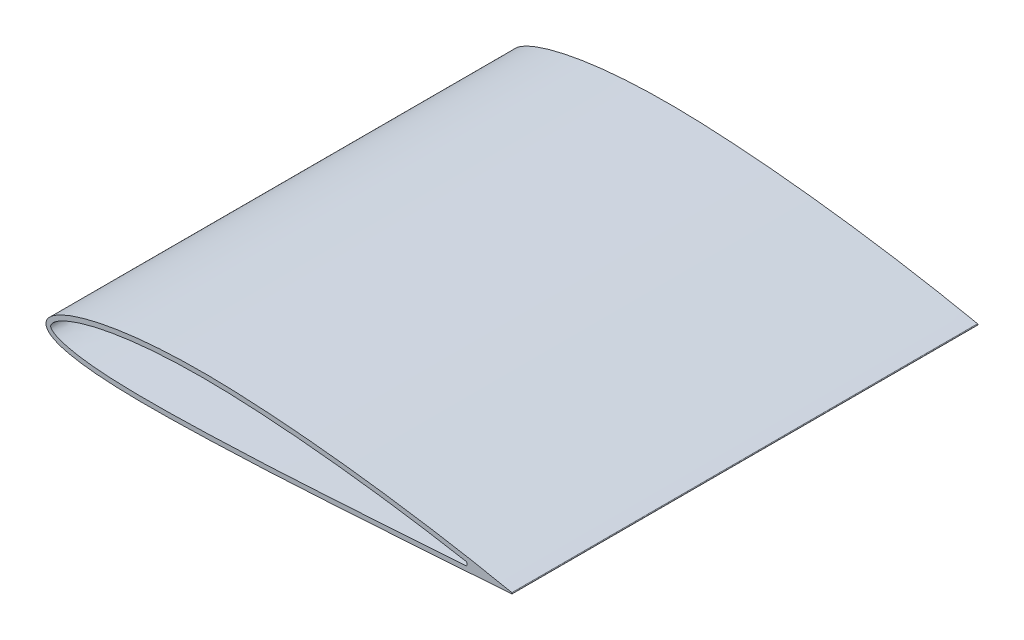
ISO-10303-21;
HEADER;
FILE_DESCRIPTION(('STEP AP214'),'2;1');
FILE_NAME('part.step','',(''),(''),'','','');
FILE_SCHEMA(('AUTOMOTIVE_DESIGN { 1 0 10303 214 1 1 1 1 }'));
ENDSEC;
DATA;
#1=APPLICATION_CONTEXT('core data for automotive mechanical design processes');
#2=APPLICATION_PROTOCOL_DEFINITION('international standard','automotive_design',2000,#1);
#3=PRODUCT_CONTEXT('',#1,'mechanical');
#4=PRODUCT('Part','Part','',(#3));
#5=PRODUCT_RELATED_PRODUCT_CATEGORY('part','',(#4));
#6=PRODUCT_DEFINITION_FORMATION('','',#4);
#7=PRODUCT_DEFINITION_CONTEXT('part definition',#1,'design');
#8=PRODUCT_DEFINITION('design','',#6,#7);
#9=PRODUCT_DEFINITION_SHAPE('','',#8);
#10=(LENGTH_UNIT() NAMED_UNIT(*) SI_UNIT(.MILLI.,.METRE.));
#11=(NAMED_UNIT(*) PLANE_ANGLE_UNIT() SI_UNIT($,.RADIAN.));
#12=(NAMED_UNIT(*) SI_UNIT($,.STERADIAN.) SOLID_ANGLE_UNIT());
#13=UNCERTAINTY_MEASURE_WITH_UNIT(LENGTH_MEASURE(1.E-05),#10,'distance_accuracy_value','');
#14=(GEOMETRIC_REPRESENTATION_CONTEXT(3) GLOBAL_UNCERTAINTY_ASSIGNED_CONTEXT((#13)) GLOBAL_UNIT_ASSIGNED_CONTEXT((#10,
#11,#12)) REPRESENTATION_CONTEXT('',''));
#15=CARTESIAN_POINT('',(0.,0.,0.));
#16=DIRECTION('',(0.,0.,1.));
#17=DIRECTION('',(1.,0.,0.));
#18=AXIS2_PLACEMENT_3D('',#15,#16,#17);
#19=CARTESIAN_POINT('',(100.0084,0.1257,-50.));
#20=CARTESIAN_POINT('',(99.9575006417878,0.136303081755937,-50.));
#21=CARTESIAN_POINT('',(99.7541920163566,0.178655245964887,-50.));
#22=CARTESIAN_POINT('',(99.2978769571782,0.273366978741733,-50.));
#23=CARTESIAN_POINT('',(98.5402830188608,0.429255228373811,-50.));
#24=CARTESIAN_POINT('',(97.4857254404918,0.643248231747518,-50.));
#25=CARTESIAN_POINT('',(96.1404333434782,0.911804494217144,-50.));
#26=CARTESIAN_POINT('',(94.5121744087844,1.22992061088621,-50.));
#27=CARTESIAN_POINT('',(92.610509120304,1.5921083415293,-50.));
#28=CARTESIAN_POINT('',(90.4466340394745,1.99248175179455,-50.));
#29=CARTESIAN_POINT('',(88.0332876433102,2.42422523893592,-50.));
#30=CARTESIAN_POINT('',(85.3848895453396,2.88061502468652,-50.));
#31=CARTESIAN_POINT('',(82.5172188837452,3.35474330699771,-50.));
#32=CARTESIAN_POINT('',(79.4474797418673,3.83931371203246,-50.));
#33=CARTESIAN_POINT('',(76.1941779254634,4.32719677177443,-50.));
#34=CARTESIAN_POINT('',(71.5503435843931,4.98521306770589,-50.));
#35=CARTESIAN_POINT('',(66.7275942207592,5.60405914980638,-50.));
#36=CARTESIAN_POINT('',(61.7557579202433,6.17071888034306,-50.));
#37=CARTESIAN_POINT('',(57.9004617902013,6.56952763892746,-50.));
#38=CARTESIAN_POINT('',(53.9937317033733,6.93053270192435,-50.));
#39=CARTESIAN_POINT('',(50.0598360752011,7.24644777972921,-50.));
#40=CARTESIAN_POINT('',(46.1233934133396,7.51210941454698,-50.));
#41=CARTESIAN_POINT('',(42.2045942977767,7.72123436281601,-50.));
#42=CARTESIAN_POINT('',(38.3222400692063,7.87110588804238,-50.));
#43=CARTESIAN_POINT('',(34.5002474040471,7.93415918044593,-50.));
#44=CARTESIAN_POINT('',(30.7683195438099,7.90989675298229,-50.));
#45=CARTESIAN_POINT('',(27.1568114856263,7.79775933433704,-50.));
#46=CARTESIAN_POINT('',(23.6895963362792,7.59910508048005,-50.));
#47=CARTESIAN_POINT('',(20.389609151732,7.31688787947149,-50.));
#48=CARTESIAN_POINT('',(17.2785007010388,6.95607203421987,-50.));
#49=CARTESIAN_POINT('',(14.3766029315202,6.52271381253916,-50.));
#50=CARTESIAN_POINT('',(11.7025215340396,6.02448117746504,-50.));
#51=CARTESIAN_POINT('',(9.27317556964736,5.46982243442795,-50.));
#52=CARTESIAN_POINT('',(7.10323060909228,4.86867952905806,-50.));
#53=CARTESIAN_POINT('',(5.20552883721737,4.23033653202801,-50.));
#54=CARTESIAN_POINT('',(3.59010281607919,3.5649334936196,-50.));
#55=CARTESIAN_POINT('',(2.26448505082284,2.881327397096,-50.));
#56=CARTESIAN_POINT('',(1.23198078336141,2.1863038341037,-50.));
#57=CARTESIAN_POINT('',(0.493177741150568,1.48131319264006,-50.));
#58=CARTESIAN_POINT('',(0.0485522705245891,0.752337561566812,-50.));
#59=CARTESIAN_POINT('',(-0.0570136593623045,-0.00571041771230951,-50.));
#60=CARTESIAN_POINT('',(0.196243247423825,-0.727199534008104,-50.));
#61=CARTESIAN_POINT('',(0.771771309563745,-1.35444891061111,-50.));
#62=CARTESIAN_POINT('',(1.62569911056504,-1.90367474790789,-50.));
#63=CARTESIAN_POINT('',(2.75774768096447,-2.39272267984389,-50.));
#64=CARTESIAN_POINT('',(4.16602288448137,-2.82408903967875,-50.));
#65=CARTESIAN_POINT('',(5.84462873775599,-3.1982600621209,-50.));
#66=CARTESIAN_POINT('',(7.78438739116766,-3.51428428992608,-50.));
#67=CARTESIAN_POINT('',(9.97388385069773,-3.77187784890552,-50.));
#68=CARTESIAN_POINT('',(12.3999839443877,-3.9714543991754,-50.));
#69=CARTESIAN_POINT('',(15.0482180581845,-4.11469854326143,-50.));
#70=CARTESIAN_POINT('',(17.9029955448966,-4.20389475218304,-50.));
#71=CARTESIAN_POINT('',(20.9476756212284,-4.24275896536731,-50.));
#72=CARTESIAN_POINT('',(24.1647279910577,-4.23550981543448,-50.));
#73=CARTESIAN_POINT('',(27.5357350343822,-4.18789909066796,-50.));
#74=CARTESIAN_POINT('',(31.0414974365474,-4.10572724311399,-50.));
#75=CARTESIAN_POINT('',(34.6620643552298,-3.99612622553502,-50.));
#76=CARTESIAN_POINT('',(38.3825266791671,-3.86487109700884,-50.));
#77=CARTESIAN_POINT('',(42.1859458780592,-3.72112454728212,-50.));
#78=CARTESIAN_POINT('',(46.0489227532139,-3.54729203687554,-50.));
#79=CARTESIAN_POINT('',(49.9424393487425,-3.35207456203044,-50.));
#80=CARTESIAN_POINT('',(53.8384179526144,-3.13972644784349,-50.));
#81=CARTESIAN_POINT('',(57.7132169269346,-2.91628127020657,-50.));
#82=CARTESIAN_POINT('',(61.5431764467593,-2.68580173348918,-50.));
#83=CARTESIAN_POINT('',(65.3047975262927,-2.452787617943,-50.));
#84=CARTESIAN_POINT('',(68.9748831765251,-2.22022419869638,-50.));
#85=CARTESIAN_POINT('',(72.5307541322065,-1.99138463464445,-50.));
#86=CARTESIAN_POINT('',(75.9503066540022,-1.76872011408288,-50.));
#87=CARTESIAN_POINT('',(79.2121937829807,-1.55411509645417,-50.));
#88=CARTESIAN_POINT('',(82.2959317242,-1.34954223240076,-50.));
#89=CARTESIAN_POINT('',(85.1821198000955,-1.15608962280362,-50.));
#90=CARTESIAN_POINT('',(87.8524937198297,-0.975689090094754,-50.));
#91=CARTESIAN_POINT('',(90.2900863575627,-0.809239476368863,-50.));
#92=CARTESIAN_POINT('',(92.4793196593868,-0.658331335669369,-50.));
#93=CARTESIAN_POINT('',(94.4061789761468,-0.5240513364417,-50.));
#94=CARTESIAN_POINT('',(96.0582651199385,-0.40768295662181,-50.));
#95=CARTESIAN_POINT('',(97.4248948760103,-0.310661925785944,-50.));
#96=CARTESIAN_POINT('',(98.4971789015927,-0.233770416248037,-50.));
#97=CARTESIAN_POINT('',(99.2681465010762,-0.178282012173191,-50.));
#98=CARTESIAN_POINT('',(99.7327341306056,-0.144510966638083,-50.));
#99=CARTESIAN_POINT('',(99.9397666594647,-0.129466565448862,-50.));
#100=CARTESIAN_POINT('',(99.9916,-0.1257,-50.));
#101=B_SPLINE_CURVE_WITH_KNOTS('',3,(#19,#20,#21,#22,#23,#24,#25,#26,#27,#28,#29,#30,#31,#32,
#33,#34,#35,#36,#37,#38,#39,#40,#41,#42,#43,#44,#45,#46,#47,#48,#49,#50,#51,#52,#53,#54,#55,#56,
#57,#58,#59,#60,#61,#62,#63,#64,#65,#66,#67,#68,#69,#70,#71,#72,#73,#74,#75,#76,#77,#78,#79,#80,
#81,#82,#83,#84,#85,#86,#87,#88,#89,#90,#91,#92,#93,#94,#95,#96,#97,#98,#99,#100),.UNSPECIFIED.,
.F.,.F.,(4,1,1,1,1,1,1,1,1,1,1,1,1,1,1,1,1,1,1,1,1,1,1,1,1,1,1,1,1,1,1,1,1,1,1,1,1,1,1,1,1,1,1,
1,1,1,1,1,1,1,1,1,1,1,1,1,1,1,1,1,1,1,1,1,1,1,1,1,1,1,1,1,1,1,1,1,1,1,1,4),(0.,
0.00076417244153373,0.00305235378475402,0.00684980570482115,0.0121324733985665,
0.0188679915200487,0.0270128393038132,0.0365168120832152,0.047320748010187,0.0593568710051226,
0.0725508051219635,0.0868200523054509,0.102077397543794,0.118227703036746,0.135170889253622,
0.171012918486622,0.189689890020379,0.2087182097852,0.227978894661608,0.247353901281394,
0.266722824804597,0.285966042812018,0.305032180166146,0.323824436620937,0.342143816816601,
0.359879710568799,0.37692581771828,0.393181852747689,0.408552719103574,0.422951452754658,
0.436298148768817,0.448522824449468,0.459565427988144,0.469379445279197,0.477933615883346,
0.48522033832909,0.491267538221565,0.49616782391953,0.500133390493784,0.503587222302178,
0.507040596825175,0.511000027817938,0.515876124661788,0.521872238721079,0.529071214980825,
0.537494990853373,0.547131181284723,0.557945450904502,0.569889642117144,0.582904388224719,
0.59692167175937,0.611866369391749,0.627656322240658,0.644204240139434,0.661417059233681,
0.679197208253312,0.697442956346586,0.716133922541477,0.735139063012098,0.754277540168221,
0.773432072201266,0.792486536790152,0.811323415788078,0.829826150136362,0.847880343752471,
0.865374072591972,0.882198024915322,0.898246949642392,0.91342054427208,0.927622056045171,
0.940762976250731,0.952758837637558,0.963532927047773,0.973016417754069,0.981148267698661,
0.987875251513711,0.993153530447754,0.996949037264165,0.999236150998499,1.),.UNSPECIFIED.);
#102=DIRECTION('',(0.,0.,1.));
#103=VECTOR('',#102,1.);
#104=SURFACE_OF_LINEAR_EXTRUSION('',#101,#103);
#105=DIRECTION('',(0.,0.,1.));
#106=VECTOR('',#105,1.);
#107=CARTESIAN_POINT('',(99.9916,-0.1257,-50.));
#108=LINE('',#107,#106);
#109=CARTESIAN_POINT('',(99.9916,-0.1257,-50.));
#110=VERTEX_POINT('',#109);
#111=CARTESIAN_POINT('',(99.9916,-0.1257,50.));
#112=VERTEX_POINT('',#111);
#113=EDGE_CURVE('E39',#110,#112,#108,.T.);
#114=ORIENTED_EDGE('',*,*,#113,.T.);
#115=CARTESIAN_POINT('',(100.0084,0.1257,50.));
#116=CARTESIAN_POINT('',(99.9575006417878,0.136303081755937,50.));
#117=CARTESIAN_POINT('',(99.7541920163566,0.178655245964887,50.));
#118=CARTESIAN_POINT('',(99.2978769571782,0.273366978741733,50.));
#119=CARTESIAN_POINT('',(98.5402830188608,0.429255228373811,50.));
#120=CARTESIAN_POINT('',(97.4857254404918,0.643248231747518,50.));
#121=CARTESIAN_POINT('',(96.1404333434782,0.911804494217144,50.));
#122=CARTESIAN_POINT('',(94.5121744087844,1.22992061088621,50.));
#123=CARTESIAN_POINT('',(92.610509120304,1.5921083415293,50.));
#124=CARTESIAN_POINT('',(90.4466340394745,1.99248175179455,50.));
#125=CARTESIAN_POINT('',(88.0332876433102,2.42422523893592,50.));
#126=CARTESIAN_POINT('',(85.3848895453396,2.88061502468652,50.));
#127=CARTESIAN_POINT('',(82.5172188837452,3.35474330699771,50.));
#128=CARTESIAN_POINT('',(79.4474797418673,3.83931371203246,50.));
#129=CARTESIAN_POINT('',(76.1941779254634,4.32719677177443,50.));
#130=CARTESIAN_POINT('',(71.5503435843931,4.98521306770589,50.));
#131=CARTESIAN_POINT('',(66.7275942207592,5.60405914980638,50.));
#132=CARTESIAN_POINT('',(61.7557579202433,6.17071888034306,50.));
#133=CARTESIAN_POINT('',(57.9004617902013,6.56952763892746,50.));
#134=CARTESIAN_POINT('',(53.9937317033733,6.93053270192435,50.));
#135=CARTESIAN_POINT('',(50.0598360752011,7.24644777972921,50.));
#136=CARTESIAN_POINT('',(46.1233934133396,7.51210941454698,50.));
#137=CARTESIAN_POINT('',(42.2045942977767,7.72123436281601,50.));
#138=CARTESIAN_POINT('',(38.3222400692063,7.87110588804238,50.));
#139=CARTESIAN_POINT('',(34.5002474040471,7.93415918044593,50.));
#140=CARTESIAN_POINT('',(30.7683195438099,7.90989675298229,50.));
#141=CARTESIAN_POINT('',(27.1568114856263,7.79775933433704,50.));
#142=CARTESIAN_POINT('',(23.6895963362792,7.59910508048005,50.));
#143=CARTESIAN_POINT('',(20.389609151732,7.31688787947149,50.));
#144=CARTESIAN_POINT('',(17.2785007010388,6.95607203421987,50.));
#145=CARTESIAN_POINT('',(14.3766029315202,6.52271381253916,50.));
#146=CARTESIAN_POINT('',(11.7025215340396,6.02448117746504,50.));
#147=CARTESIAN_POINT('',(9.27317556964736,5.46982243442795,50.));
#148=CARTESIAN_POINT('',(7.10323060909228,4.86867952905806,50.));
#149=CARTESIAN_POINT('',(5.20552883721737,4.23033653202801,50.));
#150=CARTESIAN_POINT('',(3.59010281607919,3.5649334936196,50.));
#151=CARTESIAN_POINT('',(2.26448505082284,2.881327397096,50.));
#152=CARTESIAN_POINT('',(1.23198078336141,2.1863038341037,50.));
#153=CARTESIAN_POINT('',(0.493177741150568,1.48131319264006,50.));
#154=CARTESIAN_POINT('',(0.0485522705245891,0.752337561566812,50.));
#155=CARTESIAN_POINT('',(-0.0570136593623045,-0.00571041771230951,50.));
#156=CARTESIAN_POINT('',(0.196243247423825,-0.727199534008104,50.));
#157=CARTESIAN_POINT('',(0.771771309563745,-1.35444891061111,50.));
#158=CARTESIAN_POINT('',(1.62569911056504,-1.90367474790789,50.));
#159=CARTESIAN_POINT('',(2.75774768096447,-2.39272267984389,50.));
#160=CARTESIAN_POINT('',(4.16602288448137,-2.82408903967875,50.));
#161=CARTESIAN_POINT('',(5.84462873775599,-3.1982600621209,50.));
#162=CARTESIAN_POINT('',(7.78438739116766,-3.51428428992608,50.));
#163=CARTESIAN_POINT('',(9.97388385069773,-3.77187784890552,50.));
#164=CARTESIAN_POINT('',(12.3999839443877,-3.9714543991754,50.));
#165=CARTESIAN_POINT('',(15.0482180581845,-4.11469854326143,50.));
#166=CARTESIAN_POINT('',(17.9029955448966,-4.20389475218304,50.));
#167=CARTESIAN_POINT('',(20.9476756212284,-4.24275896536731,50.));
#168=CARTESIAN_POINT('',(24.1647279910577,-4.23550981543448,50.));
#169=CARTESIAN_POINT('',(27.5357350343822,-4.18789909066796,50.));
#170=CARTESIAN_POINT('',(31.0414974365474,-4.10572724311399,50.));
#171=CARTESIAN_POINT('',(34.6620643552298,-3.99612622553502,50.));
#172=CARTESIAN_POINT('',(38.3825266791671,-3.86487109700884,50.));
#173=CARTESIAN_POINT('',(42.1859458780592,-3.72112454728212,50.));
#174=CARTESIAN_POINT('',(46.0489227532139,-3.54729203687554,50.));
#175=CARTESIAN_POINT('',(49.9424393487425,-3.35207456203044,50.));
#176=CARTESIAN_POINT('',(53.8384179526144,-3.13972644784349,50.));
#177=CARTESIAN_POINT('',(57.7132169269346,-2.91628127020657,50.));
#178=CARTESIAN_POINT('',(61.5431764467593,-2.68580173348918,50.));
#179=CARTESIAN_POINT('',(65.3047975262927,-2.452787617943,50.));
#180=CARTESIAN_POINT('',(68.9748831765251,-2.22022419869638,50.));
#181=CARTESIAN_POINT('',(72.5307541322065,-1.99138463464445,50.));
#182=CARTESIAN_POINT('',(75.9503066540022,-1.76872011408288,50.));
#183=CARTESIAN_POINT('',(79.2121937829807,-1.55411509645417,50.));
#184=CARTESIAN_POINT('',(82.2959317242,-1.34954223240076,50.));
#185=CARTESIAN_POINT('',(85.1821198000955,-1.15608962280362,50.));
#186=CARTESIAN_POINT('',(87.8524937198297,-0.975689090094754,50.));
#187=CARTESIAN_POINT('',(90.2900863575627,-0.809239476368863,50.));
#188=CARTESIAN_POINT('',(92.4793196593868,-0.658331335669369,50.));
#189=CARTESIAN_POINT('',(94.4061789761468,-0.5240513364417,50.));
#190=CARTESIAN_POINT('',(96.0582651199385,-0.40768295662181,50.));
#191=CARTESIAN_POINT('',(97.4248948760103,-0.310661925785944,50.));
#192=CARTESIAN_POINT('',(98.4971789015927,-0.233770416248037,50.));
#193=CARTESIAN_POINT('',(99.2681465010762,-0.178282012173191,50.));
#194=CARTESIAN_POINT('',(99.7327341306056,-0.144510966638083,50.));
#195=CARTESIAN_POINT('',(99.9397666594647,-0.129466565448862,50.));
#196=CARTESIAN_POINT('',(99.9916,-0.1257,50.));
#197=B_SPLINE_CURVE_WITH_KNOTS('',3,(#115,#116,#117,#118,#119,#120,#121,#122,#123,#124,#125,
#126,#127,#128,#129,#130,#131,#132,#133,#134,#135,#136,#137,#138,#139,#140,#141,#142,#143,#144,
#145,#146,#147,#148,#149,#150,#151,#152,#153,#154,#155,#156,#157,#158,#159,#160,#161,#162,#163,
#164,#165,#166,#167,#168,#169,#170,#171,#172,#173,#174,#175,#176,#177,#178,#179,#180,#181,#182,
#183,#184,#185,#186,#187,#188,#189,#190,#191,#192,#193,#194,#195,#196),.UNSPECIFIED.,.F.,.F.,(4,
1,1,1,1,1,1,1,1,1,1,1,1,1,1,1,1,1,1,1,1,1,1,1,1,1,1,1,1,1,1,1,1,1,1,1,1,1,1,1,1,1,1,1,1,1,1,1,1,
1,1,1,1,1,1,1,1,1,1,1,1,1,1,1,1,1,1,1,1,1,1,1,1,1,1,1,1,1,1,4),(0.,0.00076417244153373,
0.00305235378475402,0.00684980570482115,0.0121324733985665,0.0188679915200487,
0.0270128393038132,0.0365168120832152,0.047320748010187,0.0593568710051226,0.0725508051219635,
0.0868200523054509,0.102077397543794,0.118227703036746,0.135170889253622,0.171012918486622,
0.189689890020379,0.2087182097852,0.227978894661608,0.247353901281394,0.266722824804597,
0.285966042812018,0.305032180166146,0.323824436620937,0.342143816816601,0.359879710568799,
0.37692581771828,0.393181852747689,0.408552719103574,0.422951452754658,0.436298148768817,
0.448522824449468,0.459565427988144,0.469379445279197,0.477933615883346,0.48522033832909,
0.491267538221565,0.49616782391953,0.500133390493784,0.503587222302178,0.507040596825175,
0.511000027817938,0.515876124661788,0.521872238721079,0.529071214980825,0.537494990853373,
0.547131181284723,0.557945450904502,0.569889642117144,0.582904388224719,0.59692167175937,
0.611866369391749,0.627656322240658,0.644204240139434,0.661417059233681,0.679197208253312,
0.697442956346586,0.716133922541477,0.735139063012098,0.754277540168221,0.773432072201266,
0.792486536790152,0.811323415788078,0.829826150136362,0.847880343752471,0.865374072591972,
0.882198024915322,0.898246949642392,0.91342054427208,0.927622056045171,0.940762976250731,
0.952758837637558,0.963532927047773,0.973016417754069,0.981148267698661,0.987875251513711,
0.993153530447754,0.996949037264165,0.999236150998499,1.),.UNSPECIFIED.);
#198=CARTESIAN_POINT('',(100.0084,0.1257,50.));
#199=VERTEX_POINT('',#198);
#200=EDGE_CURVE('E122',#199,#112,#197,.T.);
#201=ORIENTED_EDGE('',*,*,#200,.F.);
#202=DIRECTION('',(0.,0.,1.));
#203=VECTOR('',#202,1.);
#204=CARTESIAN_POINT('',(100.0084,0.1257,-50.));
#205=LINE('',#204,#203);
#206=CARTESIAN_POINT('',(100.0084,0.1257,-50.));
#207=VERTEX_POINT('',#206);
#208=EDGE_CURVE('E11',#207,#199,#205,.T.);
#209=ORIENTED_EDGE('',*,*,#208,.F.);
#210=EDGE_CURVE('E123',#207,#110,#101,.T.);
#211=ORIENTED_EDGE('',*,*,#210,.T.);
#212=EDGE_LOOP('',(#114,#201,#209,#211));
#213=FACE_BOUND('',#212,.T.);
#214=ADVANCED_FACE('F35',(#213),#104,.T.);
#215=CARTESIAN_POINT('',(99.9823802152775,0.00117745578097881,-50.));
#216=DIRECTION('',(0.,0.,1.));
#217=DIRECTION('',(1.,0.,0.));
#218=AXIS2_PLACEMENT_3D('',#215,#216,#217);
#219=CYLINDRICAL_SURFACE('',#218,0.127212001068232);
#220=ORIENTED_EDGE('',*,*,#208,.T.);
#221=CARTESIAN_POINT('',(99.9823802152775,0.00117745578097881,50.));
#222=DIRECTION('',(0.,0.,1.));
#223=DIRECTION('',(-1.,0.,0.));
#224=AXIS2_PLACEMENT_3D('',#221,#222,#223);
#225=CIRCLE('',#224,0.127212001068232);
#226=EDGE_CURVE('E115',#112,#199,#225,.T.);
#227=ORIENTED_EDGE('',*,*,#226,.F.);
#228=ORIENTED_EDGE('',*,*,#113,.F.);
#229=CARTESIAN_POINT('',(99.9823802152775,0.00117745578097881,-50.));
#230=DIRECTION('',(0.,0.,1.));
#231=DIRECTION('',(-1.,0.,0.));
#232=AXIS2_PLACEMENT_3D('',#229,#230,#231);
#233=CIRCLE('',#232,0.127212001068232);
#234=EDGE_CURVE('E118',#110,#207,#233,.T.);
#235=ORIENTED_EDGE('',*,*,#234,.T.);
#236=EDGE_LOOP('',(#220,#227,#228,#235));
#237=FACE_BOUND('',#236,.T.);
#238=ADVANCED_FACE('F104',(#237),#219,.T.);
#239=CARTESIAN_POINT('',(0.0949884047592712,0.725559070667126,-50.));
#240=DIRECTION('',(0.,0.,-1.));
#241=DIRECTION('',(-1.,0.,0.));
#242=AXIS2_PLACEMENT_3D('',#239,#240,#241);
#243=PLANE('',#242);
#244=CARTESIAN_POINT('',(90.2254297675662,0.188925752533863,-50.));
#245=CARTESIAN_POINT('',(86.3917270205178,-0.0740794826254042,-50.));
#246=CARTESIAN_POINT('',(78.7236075324969,-0.587537275044594,-50.));
#247=CARTESIAN_POINT('',(67.2191298203727,-1.33609364100195,-50.));
#248=CARTESIAN_POINT('',(55.7152353574862,-2.04382022666368,-50.));
#249=CARTESIAN_POINT('',(46.1301287789258,-2.56128382805623,-50.));
#250=CARTESIAN_POINT('',(38.4616528141261,-2.864682945757,-50.));
#251=CARTESIAN_POINT('',(32.7041610475792,-3.06273125170188,-50.));
#252=CARTESIAN_POINT('',(26.9532983979744,-3.20827101515927,-50.));
#253=CARTESIAN_POINT('',(21.2079812777182,-3.26144589830252,-50.));
#254=CARTESIAN_POINT('',(15.4765693689314,-3.16252888833659,-50.));
#255=CARTESIAN_POINT('',(10.7257526542787,-2.87294905568461,-50.));
#256=CARTESIAN_POINT('',(7.449835773396,-2.45962957972359,-50.));
#257=CARTESIAN_POINT('',(5.61314130623256,-2.12595351430933,-50.));
#258=CARTESIAN_POINT('',(4.26522875064275,-1.81154161365711,-50.));
#259=CARTESIAN_POINT('',(2.97610461269597,-1.40759359078016,-50.));
#260=CARTESIAN_POINT('',(1.79512466062634,-0.880663228352444,-50.));
#261=CARTESIAN_POINT('',(1.10758556100872,-0.288136624993371,-50.));
#262=CARTESIAN_POINT('',(0.979957435234556,0.0776201459086632,-50.));
#263=CARTESIAN_POINT('',(0.998172673536416,0.419051750067922,-50.));
#264=CARTESIAN_POINT('',(1.48450944880804,1.1212495905123,-50.));
#265=CARTESIAN_POINT('',(2.52385370753079,1.87082828027452,-50.));
#266=CARTESIAN_POINT('',(3.70219288747207,2.5073584412873,-50.));
#267=CARTESIAN_POINT('',(5.38454910491288,3.23975763807053,-50.));
#268=CARTESIAN_POINT('',(7.59682353002519,3.98712410494964,-50.));
#269=CARTESIAN_POINT('',(10.3302739105193,4.70412481015007,-50.));
#270=CARTESIAN_POINT('',(13.1093684331999,5.28433508904608,-50.));
#271=CARTESIAN_POINT('',(16.8534027227903,5.90984872392655,-50.));
#272=CARTESIAN_POINT('',(21.5809448429757,6.45859644337838,-50.));
#273=CARTESIAN_POINT('',(27.2897634233443,6.82739350341328,-50.));
#274=CARTESIAN_POINT('',(33.0167408040904,6.95525043498073,-50.));
#275=CARTESIAN_POINT('',(38.7463220589115,6.87375014704901,-50.));
#276=CARTESIAN_POINT('',(46.3961037062899,6.52855551880696,-50.));
#277=CARTESIAN_POINT('',(55.9489473748948,5.80867608395894,-50.));
#278=CARTESIAN_POINT('',(67.382503041369,4.55778180896341,-50.));
#279=CARTESIAN_POINT('',(78.7779704527553,2.97941278864366,-50.));
#280=CARTESIAN_POINT('',(86.342842876454,1.71866587687634,-50.));
#281=CARTESIAN_POINT('',(90.1152906933034,1.03396947972568,-50.));
#282=B_SPLINE_CURVE_WITH_KNOTS('',3,(#244,#245,#246,#247,#248,#249,#250,#251,#252,#253,#254,
#255,#256,#257,#258,#259,#260,#261,#262,#263,#264,#265,#266,#267,#268,#269,#270,#271,#272,#273,
#274,#275,#276,#277,#278,#279,#280,#281),.UNSPECIFIED.,.F.,.F.,(4,1,1,1,1,1,1,1,1,1,1,1,1,1,1,1,
1,1,1,1,1,1,1,1,1,1,1,1,1,1,1,1,1,1,1,4),(0.0476297434255564,0.104122253431871,
0.160614763438187,0.217107273444502,0.273599783450817,0.301846038453974,0.330092293457132,
0.358338548460289,0.386584803463447,0.414831058466604,0.443077313469762,0.45720044097134,
0.46426200472213,0.471323568472919,0.478385132223709,0.485446695974498,0.492508259725287,
0.496039041600682,0.499569823476077,0.506631387226866,0.513692950977656,0.520754514728445,
0.527816078479234,0.541939205980813,0.556062333482392,0.57018546098397,0.584308588485549,
0.612554843488707,0.640801098491864,0.669047353495022,0.697293608498179,0.725539863501337,
0.782032373507652,0.838524883513967,0.895017393520282,0.951509903526597),.UNSPECIFIED.);
#283=CARTESIAN_POINT('',(90.2254297675662,0.188925752533863,-50.));
#284=VERTEX_POINT('',#283);
#285=CARTESIAN_POINT('',(90.1152906933034,1.03396947972568,-50.));
#286=VERTEX_POINT('',#285);
#287=EDGE_CURVE('E50',#284,#286,#282,.T.);
#288=ORIENTED_EDGE('',*,*,#287,.F.);
#289=CARTESIAN_POINT('',(89.9408366328284,0.58153257653077,-50.));
#290=DIRECTION('',(0.,0.,-1.));
#291=DIRECTION('',(-1.,0.,0.));
#292=AXIS2_PLACEMENT_3D('',#289,#290,#291);
#293=CIRCLE('',#292,0.484905527488417);
#294=EDGE_CURVE('E86',#286,#284,#293,.T.);
#295=ORIENTED_EDGE('',*,*,#294,.F.);
#296=EDGE_LOOP('',(#288,#295));
#297=FACE_BOUND('',#296,.T.);
#298=ORIENTED_EDGE('',*,*,#210,.F.);
#299=ORIENTED_EDGE('',*,*,#234,.F.);
#300=EDGE_LOOP('',(#298,#299));
#301=FACE_BOUND('',#300,.T.);
#302=ADVANCED_FACE('F102',(#297,#301),#243,.T.);
#303=CARTESIAN_POINT('',(0.0949884047592712,0.725559070667126,50.));
#304=DIRECTION('',(0.,0.,-1.));
#305=DIRECTION('',(-1.,0.,0.));
#306=AXIS2_PLACEMENT_3D('',#303,#304,#305);
#307=PLANE('',#306);
#308=CARTESIAN_POINT('',(89.9408366328284,0.58153257653077,50.));
#309=DIRECTION('',(0.,0.,-1.));
#310=DIRECTION('',(-1.,0.,0.));
#311=AXIS2_PLACEMENT_3D('',#308,#309,#310);
#312=CIRCLE('',#311,0.484905527488417);
#313=CARTESIAN_POINT('',(90.1152906933034,1.03396947972568,50.));
#314=VERTEX_POINT('',#313);
#315=CARTESIAN_POINT('',(90.2254297675662,0.188925752533862,50.));
#316=VERTEX_POINT('',#315);
#317=EDGE_CURVE('E78',#314,#316,#312,.T.);
#318=ORIENTED_EDGE('',*,*,#317,.T.);
#319=CARTESIAN_POINT('',(90.2254297675662,0.188925752533863,50.));
#320=CARTESIAN_POINT('',(86.3917270205178,-0.0740794826254042,50.));
#321=CARTESIAN_POINT('',(78.7236075324969,-0.587537275044594,50.));
#322=CARTESIAN_POINT('',(67.2191298203727,-1.33609364100195,50.));
#323=CARTESIAN_POINT('',(55.7152353574862,-2.04382022666368,50.));
#324=CARTESIAN_POINT('',(46.1301287789258,-2.56128382805623,50.));
#325=CARTESIAN_POINT('',(38.4616528141261,-2.864682945757,50.));
#326=CARTESIAN_POINT('',(32.7041610475792,-3.06273125170188,50.));
#327=CARTESIAN_POINT('',(26.9532983979744,-3.20827101515927,50.));
#328=CARTESIAN_POINT('',(21.2079812777182,-3.26144589830252,50.));
#329=CARTESIAN_POINT('',(15.4765693689314,-3.16252888833659,50.));
#330=CARTESIAN_POINT('',(10.7257526542787,-2.87294905568461,50.));
#331=CARTESIAN_POINT('',(7.449835773396,-2.45962957972359,50.));
#332=CARTESIAN_POINT('',(5.61314130623256,-2.12595351430933,50.));
#333=CARTESIAN_POINT('',(4.26522875064275,-1.81154161365711,50.));
#334=CARTESIAN_POINT('',(2.97610461269597,-1.40759359078016,50.));
#335=CARTESIAN_POINT('',(1.79512466062634,-0.880663228352444,50.));
#336=CARTESIAN_POINT('',(1.10758556100872,-0.288136624993371,50.));
#337=CARTESIAN_POINT('',(0.979957435234556,0.0776201459086632,50.));
#338=CARTESIAN_POINT('',(0.998172673536416,0.419051750067922,50.));
#339=CARTESIAN_POINT('',(1.48450944880804,1.1212495905123,50.));
#340=CARTESIAN_POINT('',(2.52385370753079,1.87082828027452,50.));
#341=CARTESIAN_POINT('',(3.70219288747207,2.5073584412873,50.));
#342=CARTESIAN_POINT('',(5.38454910491288,3.23975763807053,50.));
#343=CARTESIAN_POINT('',(7.59682353002519,3.98712410494964,50.));
#344=CARTESIAN_POINT('',(10.3302739105193,4.70412481015007,50.));
#345=CARTESIAN_POINT('',(13.1093684331999,5.28433508904608,50.));
#346=CARTESIAN_POINT('',(16.8534027227903,5.90984872392655,50.));
#347=CARTESIAN_POINT('',(21.5809448429757,6.45859644337838,50.));
#348=CARTESIAN_POINT('',(27.2897634233443,6.82739350341328,50.));
#349=CARTESIAN_POINT('',(33.0167408040904,6.95525043498073,50.));
#350=CARTESIAN_POINT('',(38.7463220589115,6.87375014704901,50.));
#351=CARTESIAN_POINT('',(46.3961037062899,6.52855551880696,50.));
#352=CARTESIAN_POINT('',(55.9489473748948,5.80867608395894,50.));
#353=CARTESIAN_POINT('',(67.382503041369,4.55778180896341,50.));
#354=CARTESIAN_POINT('',(78.7779704527553,2.97941278864366,50.));
#355=CARTESIAN_POINT('',(86.342842876454,1.71866587687634,50.));
#356=CARTESIAN_POINT('',(90.1152906933034,1.03396947972568,50.));
#357=B_SPLINE_CURVE_WITH_KNOTS('',3,(#319,#320,#321,#322,#323,#324,#325,#326,#327,#328,#329,
#330,#331,#332,#333,#334,#335,#336,#337,#338,#339,#340,#341,#342,#343,#344,#345,#346,#347,#348,
#349,#350,#351,#352,#353,#354,#355,#356),.UNSPECIFIED.,.F.,.F.,(4,1,1,1,1,1,1,1,1,1,1,1,1,1,1,1,
1,1,1,1,1,1,1,1,1,1,1,1,1,1,1,1,1,1,1,4),(0.0476297434255564,0.104122253431871,
0.160614763438187,0.217107273444502,0.273599783450817,0.301846038453974,0.330092293457132,
0.358338548460289,0.386584803463447,0.414831058466604,0.443077313469762,0.45720044097134,
0.46426200472213,0.471323568472919,0.478385132223709,0.485446695974498,0.492508259725287,
0.496039041600682,0.499569823476077,0.506631387226866,0.513692950977656,0.520754514728445,
0.527816078479234,0.541939205980813,0.556062333482392,0.57018546098397,0.584308588485549,
0.612554843488707,0.640801098491864,0.669047353495022,0.697293608498179,0.725539863501337,
0.782032373507652,0.838524883513967,0.895017393520282,0.951509903526597),.UNSPECIFIED.);
#358=EDGE_CURVE('E55',#316,#314,#357,.T.);
#359=ORIENTED_EDGE('',*,*,#358,.T.);
#360=EDGE_LOOP('',(#318,#359));
#361=FACE_BOUND('',#360,.T.);
#362=ORIENTED_EDGE('',*,*,#200,.T.);
#363=ORIENTED_EDGE('',*,*,#226,.T.);
#364=EDGE_LOOP('',(#362,#363));
#365=FACE_BOUND('',#364,.T.);
#366=ADVANCED_FACE('F84',(#361,#365),#307,.F.);
#367=DIRECTION('',(0.,0.,-1.));
#368=VECTOR('',#367,1.);
#369=SURFACE_OF_LINEAR_EXTRUSION('',#357,#368);
#370=ORIENTED_EDGE('',*,*,#287,.T.);
#371=DIRECTION('',(0.,0.,-1.));
#372=VECTOR('',#371,1.);
#373=CARTESIAN_POINT('',(90.1152906933034,1.03396947972568,50.));
#374=LINE('',#373,#372);
#375=EDGE_CURVE('E71',#314,#286,#374,.T.);
#376=ORIENTED_EDGE('',*,*,#375,.F.);
#377=ORIENTED_EDGE('',*,*,#358,.F.);
#378=DIRECTION('',(0.,0.,-1.));
#379=VECTOR('',#378,1.);
#380=CARTESIAN_POINT('',(90.2254297675662,0.188925752533863,50.));
#381=LINE('',#380,#379);
#382=EDGE_CURVE('E77',#316,#284,#381,.T.);
#383=ORIENTED_EDGE('',*,*,#382,.T.);
#384=EDGE_LOOP('',(#370,#376,#377,#383));
#385=FACE_BOUND('',#384,.T.);
#386=ADVANCED_FACE('F73',(#385),#369,.F.);
#387=CARTESIAN_POINT('',(89.9408366328284,0.58153257653077,50.));
#388=DIRECTION('',(0.,0.,-1.));
#389=DIRECTION('',(-1.,0.,0.));
#390=AXIS2_PLACEMENT_3D('',#387,#388,#389);
#391=CYLINDRICAL_SURFACE('',#390,0.484905527488417);
#392=ORIENTED_EDGE('',*,*,#294,.T.);
#393=ORIENTED_EDGE('',*,*,#382,.F.);
#394=ORIENTED_EDGE('',*,*,#317,.F.);
#395=ORIENTED_EDGE('',*,*,#375,.T.);
#396=EDGE_LOOP('',(#392,#393,#394,#395));
#397=FACE_BOUND('',#396,.T.);
#398=ADVANCED_FACE('F81',(#397),#391,.F.);
#399=CLOSED_SHELL('',(#214,#238,#302,#366,#386,#398));
#400=MANIFOLD_SOLID_BREP('B2',#399);
#401=ADVANCED_BREP_SHAPE_REPRESENTATION('',(#18,#400),#14);
#402=SHAPE_DEFINITION_REPRESENTATION(#9,#401);
ENDSEC;
END-ISO-10303-21;
